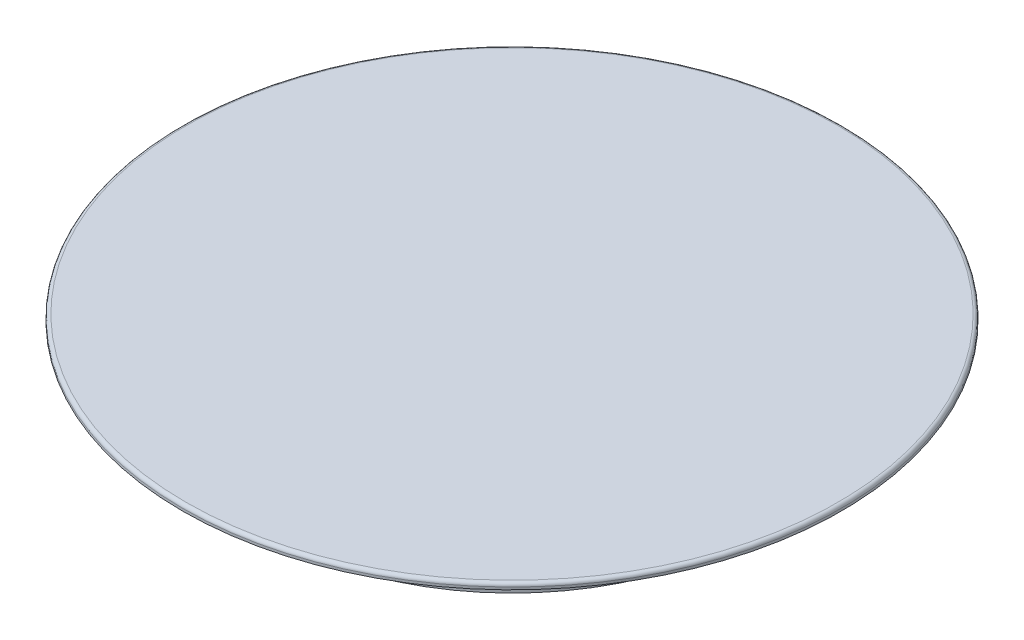
ISO-10303-21;
HEADER;
FILE_DESCRIPTION(('STEP AP214'),'2;1');
FILE_NAME('part.step','',(''),(''),'','','');
FILE_SCHEMA(('AUTOMOTIVE_DESIGN { 1 0 10303 214 1 1 1 1 }'));
ENDSEC;
DATA;
#1=APPLICATION_CONTEXT('core data for automotive mechanical design processes');
#2=APPLICATION_PROTOCOL_DEFINITION('international standard','automotive_design',2000,#1);
#3=PRODUCT_CONTEXT('',#1,'mechanical');
#4=PRODUCT('Part','Part','',(#3));
#5=PRODUCT_RELATED_PRODUCT_CATEGORY('part','',(#4));
#6=PRODUCT_DEFINITION_FORMATION('','',#4);
#7=PRODUCT_DEFINITION_CONTEXT('part definition',#1,'design');
#8=PRODUCT_DEFINITION('design','',#6,#7);
#9=PRODUCT_DEFINITION_SHAPE('','',#8);
#10=(LENGTH_UNIT() NAMED_UNIT(*) SI_UNIT(.MILLI.,.METRE.));
#11=(NAMED_UNIT(*) PLANE_ANGLE_UNIT() SI_UNIT($,.RADIAN.));
#12=(NAMED_UNIT(*) SI_UNIT($,.STERADIAN.) SOLID_ANGLE_UNIT());
#13=UNCERTAINTY_MEASURE_WITH_UNIT(LENGTH_MEASURE(1.E-05),#10,'distance_accuracy_value','');
#14=(GEOMETRIC_REPRESENTATION_CONTEXT(3) GLOBAL_UNCERTAINTY_ASSIGNED_CONTEXT((#13)) GLOBAL_UNIT_ASSIGNED_CONTEXT((#10,
#11,#12)) REPRESENTATION_CONTEXT('',''));
#15=CARTESIAN_POINT('',(0.,0.,0.));
#16=DIRECTION('',(0.,0.,1.));
#17=DIRECTION('',(1.,0.,0.));
#18=AXIS2_PLACEMENT_3D('',#15,#16,#17);
#19=CARTESIAN_POINT('',(0.,1.7,0.));
#20=DIRECTION('',(0.,-1.,0.));
#21=DIRECTION('',(0.,0.,-1.));
#22=AXIS2_PLACEMENT_3D('',#19,#20,#21);
#23=CYLINDRICAL_SURFACE('',#22,95.);
#24=CARTESIAN_POINT('',(0.,0.7,0.));
#25=DIRECTION('',(0.,1.,0.));
#26=DIRECTION('',(0.,0.,1.));
#27=AXIS2_PLACEMENT_3D('',#24,#25,#26);
#28=CIRCLE('',#27,95.);
#29=CARTESIAN_POINT('',(0.,0.7,95.));
#30=VERTEX_POINT('',#29);
#31=EDGE_CURVE('E51',#30,#30,#28,.F.);
#32=ORIENTED_EDGE('',*,*,#31,.T.);
#33=EDGE_LOOP('',(#32));
#34=FACE_BOUND('',#33,.T.);
#35=CARTESIAN_POINT('',(0.,0.,0.));
#36=DIRECTION('',(0.,1.,0.));
#37=DIRECTION('',(0.,0.,1.));
#38=AXIS2_PLACEMENT_3D('',#35,#36,#37);
#39=CIRCLE('',#38,95.);
#40=CARTESIAN_POINT('',(0.,0.,95.));
#41=VERTEX_POINT('',#40);
#42=EDGE_CURVE('E61',#41,#41,#39,.T.);
#43=ORIENTED_EDGE('',*,*,#42,.T.);
#44=EDGE_LOOP('',(#43));
#45=FACE_BOUND('',#44,.T.);
#46=ADVANCED_FACE('F43',(#34,#45),#23,.T.);
#47=CARTESIAN_POINT('',(0.,1.7,0.));
#48=DIRECTION('',(0.,1.,0.));
#49=DIRECTION('',(0.,0.,1.));
#50=AXIS2_PLACEMENT_3D('',#47,#48,#49);
#51=PLANE('',#50);
#52=CARTESIAN_POINT('',(0.,1.7,0.));
#53=DIRECTION('',(0.,1.,0.));
#54=DIRECTION('',(0.,0.,1.));
#55=AXIS2_PLACEMENT_3D('',#52,#53,#54);
#56=CIRCLE('',#55,94.);
#57=CARTESIAN_POINT('',(0.,1.7,94.));
#58=VERTEX_POINT('',#57);
#59=EDGE_CURVE('E56',#58,#58,#56,.T.);
#60=ORIENTED_EDGE('',*,*,#59,.T.);
#61=EDGE_LOOP('',(#60));
#62=FACE_BOUND('',#61,.T.);
#63=ADVANCED_FACE('F85',(#62),#51,.T.);
#64=CARTESIAN_POINT('',(0.,0.,0.));
#65=DIRECTION('',(0.,1.,0.));
#66=DIRECTION('',(0.,0.,1.));
#67=AXIS2_PLACEMENT_3D('',#64,#65,#66);
#68=PLANE('',#67);
#69=CARTESIAN_POINT('',(0.,0.,0.));
#70=DIRECTION('',(0.,1.,0.));
#71=DIRECTION('',(0.,0.,1.));
#72=AXIS2_PLACEMENT_3D('',#69,#70,#71);
#73=CIRCLE('',#72,69.3539657644027);
#74=CARTESIAN_POINT('',(0.,0.,69.3539657644027));
#75=VERTEX_POINT('',#74);
#76=EDGE_CURVE('E10',#75,#75,#73,.F.);
#77=ORIENTED_EDGE('',*,*,#76,.F.);
#78=EDGE_LOOP('',(#77));
#79=FACE_BOUND('',#78,.T.);
#80=ORIENTED_EDGE('',*,*,#42,.F.);
#81=EDGE_LOOP('',(#80));
#82=FACE_BOUND('',#81,.T.);
#83=ADVANCED_FACE('F82',(#79,#82),#68,.F.);
#84=CARTESIAN_POINT('',(0.,0.7,0.));
#85=DIRECTION('',(0.,1.,0.));
#86=DIRECTION('',(0.,0.,1.));
#87=AXIS2_PLACEMENT_3D('',#84,#85,#86);
#88=TOROIDAL_SURFACE('',#87,94.,1.);
#89=ORIENTED_EDGE('',*,*,#31,.F.);
#90=EDGE_LOOP('',(#89));
#91=FACE_BOUND('',#90,.T.);
#92=ORIENTED_EDGE('',*,*,#59,.F.);
#93=EDGE_LOOP('',(#92));
#94=FACE_BOUND('',#93,.T.);
#95=ADVANCED_FACE('F75',(#91,#94),#88,.T.);
#96=CARTESIAN_POINT('',(0.,-18.5,0.));
#97=DIRECTION('',(0.,-1.,0.));
#98=DIRECTION('',(0.,0.,-1.));
#99=AXIS2_PLACEMENT_3D('',#96,#97,#98);
#100=CONICAL_SURFACE('',#99,70.,0.0349065850398867);
#101=CARTESIAN_POINT('',(0.,-18.5,0.));
#102=DIRECTION('',(0.,-1.,0.));
#103=DIRECTION('',(0.,0.,-1.));
#104=AXIS2_PLACEMENT_3D('',#101,#102,#103);
#105=CIRCLE('',#104,70.);
#106=CARTESIAN_POINT('',(0.,-18.5,-70.));
#107=VERTEX_POINT('',#106);
#108=EDGE_CURVE('E67',#107,#107,#105,.T.);
#109=ORIENTED_EDGE('',*,*,#108,.F.);
#110=EDGE_LOOP('',(#109));
#111=FACE_BOUND('',#110,.T.);
#112=ORIENTED_EDGE('',*,*,#76,.T.);
#113=EDGE_LOOP('',(#112));
#114=FACE_BOUND('',#113,.T.);
#115=ADVANCED_FACE('F45',(#111,#114),#100,.T.);
#116=CARTESIAN_POINT('',(0.,-18.5,0.));
#117=DIRECTION('',(0.,-1.,0.));
#118=DIRECTION('',(0.,0.,-1.));
#119=AXIS2_PLACEMENT_3D('',#116,#117,#118);
#120=PLANE('',#119);
#121=ORIENTED_EDGE('',*,*,#108,.T.);
#122=EDGE_LOOP('',(#121));
#123=FACE_BOUND('',#122,.T.);
#124=ADVANCED_FACE('F72',(#123),#120,.T.);
#125=CLOSED_SHELL('',(#46,#63,#83,#95,#115,#124));
#126=MANIFOLD_SOLID_BREP('B2',#125);
#127=ADVANCED_BREP_SHAPE_REPRESENTATION('',(#18,#126),#14);
#128=SHAPE_DEFINITION_REPRESENTATION(#9,#127);
ENDSEC;
END-ISO-10303-21;
